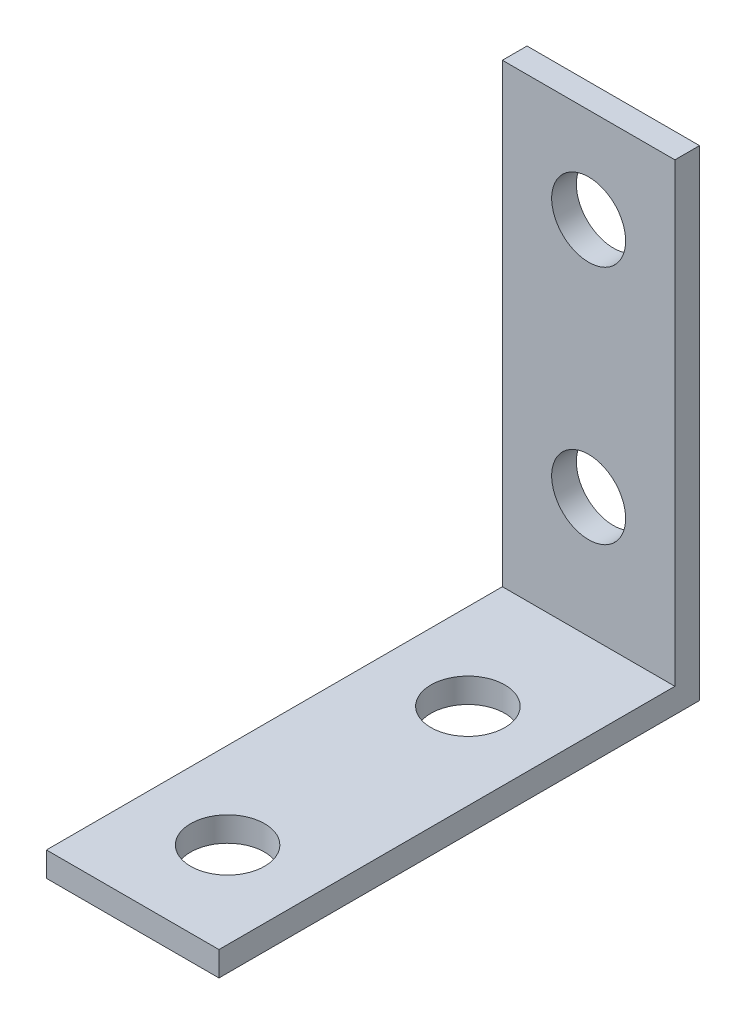
ISO-10303-21;
HEADER;
FILE_DESCRIPTION(('STEP AP214'),'2;1');
FILE_NAME('part.step','',(''),(''),'','','');
FILE_SCHEMA(('AUTOMOTIVE_DESIGN { 1 0 10303 214 1 1 1 1 }'));
ENDSEC;
DATA;
#1=APPLICATION_CONTEXT('core data for automotive mechanical design processes');
#2=APPLICATION_PROTOCOL_DEFINITION('international standard','automotive_design',2000,#1);
#3=PRODUCT_CONTEXT('',#1,'mechanical');
#4=PRODUCT('Part','Part','',(#3));
#5=PRODUCT_RELATED_PRODUCT_CATEGORY('part','',(#4));
#6=PRODUCT_DEFINITION_FORMATION('','',#4);
#7=PRODUCT_DEFINITION_CONTEXT('part definition',#1,'design');
#8=PRODUCT_DEFINITION('design','',#6,#7);
#9=PRODUCT_DEFINITION_SHAPE('','',#8);
#10=(LENGTH_UNIT() NAMED_UNIT(*) SI_UNIT(.MILLI.,.METRE.));
#11=(NAMED_UNIT(*) PLANE_ANGLE_UNIT() SI_UNIT($,.RADIAN.));
#12=(NAMED_UNIT(*) SI_UNIT($,.STERADIAN.) SOLID_ANGLE_UNIT());
#13=UNCERTAINTY_MEASURE_WITH_UNIT(LENGTH_MEASURE(1.E-05),#10,'distance_accuracy_value','');
#14=(GEOMETRIC_REPRESENTATION_CONTEXT(3) GLOBAL_UNCERTAINTY_ASSIGNED_CONTEXT((#13)) GLOBAL_UNIT_ASSIGNED_CONTEXT((#10,
#11,#12)) REPRESENTATION_CONTEXT('',''));
#15=CARTESIAN_POINT('',(0.,0.,0.));
#16=DIRECTION('',(0.,0.,1.));
#17=DIRECTION('',(1.,0.,0.));
#18=AXIS2_PLACEMENT_3D('',#15,#16,#17);
#19=CARTESIAN_POINT('',(14.,0.,21.4942610475525));
#20=DIRECTION('',(0.,0.,-1.));
#21=DIRECTION('',(-1.,0.,0.));
#22=AXIS2_PLACEMENT_3D('',#19,#20,#21);
#23=PLANE('',#22);
#24=DIRECTION('',(0.,-1.,0.));
#25=VECTOR('',#24,1.);
#26=CARTESIAN_POINT('',(0.,0.,21.4942610475525));
#27=LINE('',#26,#25);
#28=CARTESIAN_POINT('',(0.,2.,21.4942610475525));
#29=VERTEX_POINT('',#28);
#30=CARTESIAN_POINT('',(0.,0.,21.4942610475525));
#31=VERTEX_POINT('',#30);
#32=EDGE_CURVE('E116',#29,#31,#27,.T.);
#33=ORIENTED_EDGE('',*,*,#32,.T.);
#34=DIRECTION('',(-1.,0.,0.));
#35=VECTOR('',#34,1.);
#36=CARTESIAN_POINT('',(14.,0.,21.4942610475525));
#37=LINE('',#36,#35);
#38=CARTESIAN_POINT('',(14.,0.,21.4942610475525));
#39=VERTEX_POINT('',#38);
#40=EDGE_CURVE('E11',#39,#31,#37,.T.);
#41=ORIENTED_EDGE('',*,*,#40,.F.);
#42=DIRECTION('',(0.,-1.,0.));
#43=VECTOR('',#42,1.);
#44=CARTESIAN_POINT('',(14.,0.,21.4942610475525));
#45=LINE('',#44,#43);
#46=CARTESIAN_POINT('',(14.,2.,21.4942610475525));
#47=VERTEX_POINT('',#46);
#48=EDGE_CURVE('E127',#47,#39,#45,.T.);
#49=ORIENTED_EDGE('',*,*,#48,.F.);
#50=DIRECTION('',(-1.,0.,0.));
#51=VECTOR('',#50,1.);
#52=CARTESIAN_POINT('',(14.,2.,21.4942610475525));
#53=LINE('',#52,#51);
#54=EDGE_CURVE('E112',#47,#29,#53,.T.);
#55=ORIENTED_EDGE('',*,*,#54,.T.);
#56=EDGE_LOOP('',(#33,#41,#49,#55));
#57=FACE_BOUND('',#56,.T.);
#58=ADVANCED_FACE('F32',(#57),#23,.F.);
#59=CARTESIAN_POINT('',(14.,0.,-17.5057389524475));
#60=DIRECTION('',(0.,1.,0.));
#61=DIRECTION('',(0.,0.,1.));
#62=AXIS2_PLACEMENT_3D('',#59,#60,#61);
#63=PLANE('',#62);
#64=CARTESIAN_POINT('',(7.,0.,-5.70573895244747));
#65=DIRECTION('',(0.,1.,0.));
#66=DIRECTION('',(0.,0.,1.));
#67=AXIS2_PLACEMENT_3D('',#64,#65,#66);
#68=CIRCLE('',#67,3.);
#69=CARTESIAN_POINT('',(7.,0.,-2.70573895244747));
#70=VERTEX_POINT('',#69);
#71=EDGE_CURVE('E260',#70,#70,#68,.T.);
#72=ORIENTED_EDGE('',*,*,#71,.T.);
#73=EDGE_LOOP('',(#72));
#74=FACE_BOUND('',#73,.T.);
#75=CARTESIAN_POINT('',(7.,0.,13.7942610475525));
#76=DIRECTION('',(0.,1.,0.));
#77=DIRECTION('',(0.,0.,1.));
#78=AXIS2_PLACEMENT_3D('',#75,#76,#77);
#79=CIRCLE('',#78,3.);
#80=CARTESIAN_POINT('',(7.,0.,16.7942610475525));
#81=VERTEX_POINT('',#80);
#82=EDGE_CURVE('E120',#81,#81,#79,.T.);
#83=ORIENTED_EDGE('',*,*,#82,.T.);
#84=EDGE_LOOP('',(#83));
#85=FACE_BOUND('',#84,.T.);
#86=DIRECTION('',(0.,0.,-1.));
#87=VECTOR('',#86,1.);
#88=CARTESIAN_POINT('',(0.,0.,-17.5057389524475));
#89=LINE('',#88,#87);
#90=CARTESIAN_POINT('',(0.,0.,-17.5057389524475));
#91=VERTEX_POINT('',#90);
#92=EDGE_CURVE('E119',#31,#91,#89,.T.);
#93=ORIENTED_EDGE('',*,*,#92,.T.);
#94=DIRECTION('',(-1.,0.,0.));
#95=VECTOR('',#94,1.);
#96=CARTESIAN_POINT('',(14.,0.,-17.5057389524475));
#97=LINE('',#96,#95);
#98=CARTESIAN_POINT('',(14.,0.,-17.5057389524475));
#99=VERTEX_POINT('',#98);
#100=EDGE_CURVE('E40',#99,#91,#97,.T.);
#101=ORIENTED_EDGE('',*,*,#100,.F.);
#102=DIRECTION('',(0.,0.,-1.));
#103=VECTOR('',#102,1.);
#104=CARTESIAN_POINT('',(14.,0.,-17.5057389524475));
#105=LINE('',#104,#103);
#106=EDGE_CURVE('E85',#39,#99,#105,.T.);
#107=ORIENTED_EDGE('',*,*,#106,.F.);
#108=ORIENTED_EDGE('',*,*,#40,.T.);
#109=EDGE_LOOP('',(#93,#101,#107,#108));
#110=FACE_BOUND('',#109,.T.);
#111=ADVANCED_FACE('F155',(#74,#85,#110),#63,.F.);
#112=CARTESIAN_POINT('',(14.,39.,-17.5057389524475));
#113=DIRECTION('',(0.,0.,1.));
#114=DIRECTION('',(0.,-1.,0.));
#115=AXIS2_PLACEMENT_3D('',#112,#113,#114);
#116=PLANE('',#115);
#117=CARTESIAN_POINT('',(7.,31.3,-17.5057389524475));
#118=DIRECTION('',(0.,0.,1.));
#119=DIRECTION('',(1.,0.,0.));
#120=AXIS2_PLACEMENT_3D('',#117,#118,#119);
#121=CIRCLE('',#120,3.);
#122=CARTESIAN_POINT('',(10.,31.3,-17.5057389524475));
#123=VERTEX_POINT('',#122);
#124=EDGE_CURVE('E274',#123,#123,#121,.T.);
#125=ORIENTED_EDGE('',*,*,#124,.T.);
#126=EDGE_LOOP('',(#125));
#127=FACE_BOUND('',#126,.T.);
#128=CARTESIAN_POINT('',(7.,11.8,-17.5057389524475));
#129=DIRECTION('',(0.,0.,1.));
#130=DIRECTION('',(1.,0.,0.));
#131=AXIS2_PLACEMENT_3D('',#128,#129,#130);
#132=CIRCLE('',#131,3.);
#133=CARTESIAN_POINT('',(10.,11.8,-17.5057389524475));
#134=VERTEX_POINT('',#133);
#135=EDGE_CURVE('E269',#134,#134,#132,.T.);
#136=ORIENTED_EDGE('',*,*,#135,.T.);
#137=EDGE_LOOP('',(#136));
#138=FACE_BOUND('',#137,.T.);
#139=DIRECTION('',(0.,1.,0.));
#140=VECTOR('',#139,1.);
#141=CARTESIAN_POINT('',(0.,39.,-17.5057389524475));
#142=LINE('',#141,#140);
#143=CARTESIAN_POINT('',(0.,39.,-17.5057389524475));
#144=VERTEX_POINT('',#143);
#145=EDGE_CURVE('E122',#91,#144,#142,.T.);
#146=ORIENTED_EDGE('',*,*,#145,.T.);
#147=DIRECTION('',(-1.,0.,0.));
#148=VECTOR('',#147,1.);
#149=CARTESIAN_POINT('',(14.,39.,-17.5057389524475));
#150=LINE('',#149,#148);
#151=CARTESIAN_POINT('',(14.,39.,-17.5057389524475));
#152=VERTEX_POINT('',#151);
#153=EDGE_CURVE('E107',#152,#144,#150,.T.);
#154=ORIENTED_EDGE('',*,*,#153,.F.);
#155=DIRECTION('',(0.,1.,0.));
#156=VECTOR('',#155,1.);
#157=CARTESIAN_POINT('',(14.,39.,-17.5057389524475));
#158=LINE('',#157,#156);
#159=EDGE_CURVE('E98',#99,#152,#158,.T.);
#160=ORIENTED_EDGE('',*,*,#159,.F.);
#161=ORIENTED_EDGE('',*,*,#100,.T.);
#162=EDGE_LOOP('',(#146,#154,#160,#161));
#163=FACE_BOUND('',#162,.T.);
#164=ADVANCED_FACE('F133',(#127,#138,#163),#116,.F.);
#165=CARTESIAN_POINT('',(14.,39.,-15.5057389524475));
#166=DIRECTION('',(0.,-1.,0.));
#167=DIRECTION('',(0.,0.,-1.));
#168=AXIS2_PLACEMENT_3D('',#165,#166,#167);
#169=PLANE('',#168);
#170=DIRECTION('',(0.,0.,1.));
#171=VECTOR('',#170,1.);
#172=CARTESIAN_POINT('',(0.,39.,-15.5057389524475));
#173=LINE('',#172,#171);
#174=CARTESIAN_POINT('',(0.,39.,-15.5057389524475));
#175=VERTEX_POINT('',#174);
#176=EDGE_CURVE('E106',#144,#175,#173,.T.);
#177=ORIENTED_EDGE('',*,*,#176,.T.);
#178=DIRECTION('',(-1.,0.,0.));
#179=VECTOR('',#178,1.);
#180=CARTESIAN_POINT('',(14.,39.,-15.5057389524475));
#181=LINE('',#180,#179);
#182=CARTESIAN_POINT('',(14.,39.,-15.5057389524475));
#183=VERTEX_POINT('',#182);
#184=EDGE_CURVE('E103',#183,#175,#181,.T.);
#185=ORIENTED_EDGE('',*,*,#184,.F.);
#186=DIRECTION('',(0.,0.,1.));
#187=VECTOR('',#186,1.);
#188=CARTESIAN_POINT('',(14.,39.,-15.5057389524475));
#189=LINE('',#188,#187);
#190=EDGE_CURVE('E92',#152,#183,#189,.T.);
#191=ORIENTED_EDGE('',*,*,#190,.F.);
#192=ORIENTED_EDGE('',*,*,#153,.T.);
#193=EDGE_LOOP('',(#177,#185,#191,#192));
#194=FACE_BOUND('',#193,.T.);
#195=ADVANCED_FACE('F104',(#194),#169,.F.);
#196=CARTESIAN_POINT('',(14.,2.,-15.5057389524475));
#197=DIRECTION('',(0.,0.,-1.));
#198=DIRECTION('',(-1.,0.,0.));
#199=AXIS2_PLACEMENT_3D('',#196,#197,#198);
#200=PLANE('',#199);
#201=CARTESIAN_POINT('',(7.,31.3,-15.5057389524475));
#202=DIRECTION('',(0.,0.,1.));
#203=DIRECTION('',(1.,0.,0.));
#204=AXIS2_PLACEMENT_3D('',#201,#202,#203);
#205=CIRCLE('',#204,3.);
#206=CARTESIAN_POINT('',(10.,31.3,-15.5057389524475));
#207=VERTEX_POINT('',#206);
#208=EDGE_CURVE('E277',#207,#207,#205,.T.);
#209=ORIENTED_EDGE('',*,*,#208,.F.);
#210=EDGE_LOOP('',(#209));
#211=FACE_BOUND('',#210,.T.);
#212=CARTESIAN_POINT('',(7.,11.8,-15.5057389524475));
#213=DIRECTION('',(0.,0.,1.));
#214=DIRECTION('',(1.,0.,0.));
#215=AXIS2_PLACEMENT_3D('',#212,#213,#214);
#216=CIRCLE('',#215,3.);
#217=CARTESIAN_POINT('',(10.,11.8,-15.5057389524475));
#218=VERTEX_POINT('',#217);
#219=EDGE_CURVE('E271',#218,#218,#216,.T.);
#220=ORIENTED_EDGE('',*,*,#219,.F.);
#221=EDGE_LOOP('',(#220));
#222=FACE_BOUND('',#221,.T.);
#223=DIRECTION('',(0.,-1.,0.));
#224=VECTOR('',#223,1.);
#225=CARTESIAN_POINT('',(0.,2.,-15.5057389524475));
#226=LINE('',#225,#224);
#227=CARTESIAN_POINT('',(0.,2.,-15.5057389524475));
#228=VERTEX_POINT('',#227);
#229=EDGE_CURVE('E71',#175,#228,#226,.T.);
#230=ORIENTED_EDGE('',*,*,#229,.T.);
#231=DIRECTION('',(-1.,0.,0.));
#232=VECTOR('',#231,1.);
#233=CARTESIAN_POINT('',(14.,2.,-15.5057389524475));
#234=LINE('',#233,#232);
#235=CARTESIAN_POINT('',(14.,2.,-15.5057389524475));
#236=VERTEX_POINT('',#235);
#237=EDGE_CURVE('E108',#236,#228,#234,.T.);
#238=ORIENTED_EDGE('',*,*,#237,.F.);
#239=DIRECTION('',(0.,-1.,0.));
#240=VECTOR('',#239,1.);
#241=CARTESIAN_POINT('',(14.,2.,-15.5057389524475));
#242=LINE('',#241,#240);
#243=EDGE_CURVE('E96',#183,#236,#242,.T.);
#244=ORIENTED_EDGE('',*,*,#243,.F.);
#245=ORIENTED_EDGE('',*,*,#184,.T.);
#246=EDGE_LOOP('',(#230,#238,#244,#245));
#247=FACE_BOUND('',#246,.T.);
#248=ADVANCED_FACE('F110',(#211,#222,#247),#200,.F.);
#249=CARTESIAN_POINT('',(14.,2.,21.4942610475525));
#250=DIRECTION('',(0.,-1.,0.));
#251=DIRECTION('',(0.,0.,-1.));
#252=AXIS2_PLACEMENT_3D('',#249,#250,#251);
#253=PLANE('',#252);
#254=CARTESIAN_POINT('',(7.,2.,-5.70573895244747));
#255=DIRECTION('',(0.,1.,0.));
#256=DIRECTION('',(0.,0.,1.));
#257=AXIS2_PLACEMENT_3D('',#254,#255,#256);
#258=CIRCLE('',#257,3.);
#259=CARTESIAN_POINT('',(7.,2.,-2.70573895244747));
#260=VERTEX_POINT('',#259);
#261=EDGE_CURVE('E263',#260,#260,#258,.T.);
#262=ORIENTED_EDGE('',*,*,#261,.F.);
#263=EDGE_LOOP('',(#262));
#264=FACE_BOUND('',#263,.T.);
#265=CARTESIAN_POINT('',(7.,2.,13.7942610475525));
#266=DIRECTION('',(0.,1.,0.));
#267=DIRECTION('',(0.,0.,1.));
#268=AXIS2_PLACEMENT_3D('',#265,#266,#267);
#269=CIRCLE('',#268,3.);
#270=CARTESIAN_POINT('',(7.,2.,16.7942610475525));
#271=VERTEX_POINT('',#270);
#272=EDGE_CURVE('E259',#271,#271,#269,.T.);
#273=ORIENTED_EDGE('',*,*,#272,.F.);
#274=EDGE_LOOP('',(#273));
#275=FACE_BOUND('',#274,.T.);
#276=DIRECTION('',(0.,0.,1.));
#277=VECTOR('',#276,1.);
#278=CARTESIAN_POINT('',(0.,2.,21.4942610475525));
#279=LINE('',#278,#277);
#280=EDGE_CURVE('E77',#228,#29,#279,.T.);
#281=ORIENTED_EDGE('',*,*,#280,.T.);
#282=ORIENTED_EDGE('',*,*,#54,.F.);
#283=DIRECTION('',(0.,0.,1.));
#284=VECTOR('',#283,1.);
#285=CARTESIAN_POINT('',(14.,2.,21.4942610475525));
#286=LINE('',#285,#284);
#287=EDGE_CURVE('E48',#236,#47,#286,.T.);
#288=ORIENTED_EDGE('',*,*,#287,.F.);
#289=ORIENTED_EDGE('',*,*,#237,.T.);
#290=EDGE_LOOP('',(#281,#282,#288,#289));
#291=FACE_BOUND('',#290,.T.);
#292=ADVANCED_FACE('F140',(#264,#275,#291),#253,.F.);
#293=CARTESIAN_POINT('',(14.,0.,0.));
#294=DIRECTION('',(-1.,0.,0.));
#295=DIRECTION('',(0.,0.,1.));
#296=AXIS2_PLACEMENT_3D('',#293,#294,#295);
#297=PLANE('',#296);
#298=ORIENTED_EDGE('',*,*,#48,.T.);
#299=ORIENTED_EDGE('',*,*,#106,.T.);
#300=ORIENTED_EDGE('',*,*,#159,.T.);
#301=ORIENTED_EDGE('',*,*,#190,.T.);
#302=ORIENTED_EDGE('',*,*,#243,.T.);
#303=ORIENTED_EDGE('',*,*,#287,.T.);
#304=EDGE_LOOP('',(#298,#299,#300,#301,#302,#303));
#305=FACE_BOUND('',#304,.T.);
#306=ADVANCED_FACE('F94',(#305),#297,.F.);
#307=CARTESIAN_POINT('',(0.,0.,0.));
#308=DIRECTION('',(-1.,0.,0.));
#309=DIRECTION('',(0.,0.,1.));
#310=AXIS2_PLACEMENT_3D('',#307,#308,#309);
#311=PLANE('',#310);
#312=ORIENTED_EDGE('',*,*,#32,.F.);
#313=ORIENTED_EDGE('',*,*,#280,.F.);
#314=ORIENTED_EDGE('',*,*,#229,.F.);
#315=ORIENTED_EDGE('',*,*,#176,.F.);
#316=ORIENTED_EDGE('',*,*,#145,.F.);
#317=ORIENTED_EDGE('',*,*,#92,.F.);
#318=EDGE_LOOP('',(#312,#313,#314,#315,#316,#317));
#319=FACE_BOUND('',#318,.T.);
#320=ADVANCED_FACE('F136',(#319),#311,.T.);
#321=CARTESIAN_POINT('',(7.,0.,13.7942610475525));
#322=DIRECTION('',(0.,1.,0.));
#323=DIRECTION('',(0.,0.,1.));
#324=AXIS2_PLACEMENT_3D('',#321,#322,#323);
#325=CYLINDRICAL_SURFACE('',#324,3.);
#326=ORIENTED_EDGE('',*,*,#82,.F.);
#327=EDGE_LOOP('',(#326));
#328=FACE_BOUND('',#327,.T.);
#329=ORIENTED_EDGE('',*,*,#272,.T.);
#330=EDGE_LOOP('',(#329));
#331=FACE_BOUND('',#330,.T.);
#332=ADVANCED_FACE('F213',(#328,#331),#325,.F.);
#333=CARTESIAN_POINT('',(7.,0.,-5.70573895244747));
#334=DIRECTION('',(0.,1.,0.));
#335=DIRECTION('',(0.,0.,1.));
#336=AXIS2_PLACEMENT_3D('',#333,#334,#335);
#337=CYLINDRICAL_SURFACE('',#336,3.);
#338=ORIENTED_EDGE('',*,*,#71,.F.);
#339=EDGE_LOOP('',(#338));
#340=FACE_BOUND('',#339,.T.);
#341=ORIENTED_EDGE('',*,*,#261,.T.);
#342=EDGE_LOOP('',(#341));
#343=FACE_BOUND('',#342,.T.);
#344=ADVANCED_FACE('F193',(#340,#343),#337,.F.);
#345=CARTESIAN_POINT('',(7.,11.8,-17.5057389524475));
#346=DIRECTION('',(0.,0.,1.));
#347=DIRECTION('',(1.,0.,0.));
#348=AXIS2_PLACEMENT_3D('',#345,#346,#347);
#349=CYLINDRICAL_SURFACE('',#348,3.);
#350=ORIENTED_EDGE('',*,*,#135,.F.);
#351=EDGE_LOOP('',(#350));
#352=FACE_BOUND('',#351,.T.);
#353=ORIENTED_EDGE('',*,*,#219,.T.);
#354=EDGE_LOOP('',(#353));
#355=FACE_BOUND('',#354,.T.);
#356=ADVANCED_FACE('F187',(#352,#355),#349,.F.);
#357=CARTESIAN_POINT('',(7.,31.3,-17.5057389524475));
#358=DIRECTION('',(0.,0.,1.));
#359=DIRECTION('',(1.,0.,0.));
#360=AXIS2_PLACEMENT_3D('',#357,#358,#359);
#361=CYLINDRICAL_SURFACE('',#360,3.);
#362=ORIENTED_EDGE('',*,*,#124,.F.);
#363=EDGE_LOOP('',(#362));
#364=FACE_BOUND('',#363,.T.);
#365=ORIENTED_EDGE('',*,*,#208,.T.);
#366=EDGE_LOOP('',(#365));
#367=FACE_BOUND('',#366,.T.);
#368=ADVANCED_FACE('F192',(#364,#367),#361,.F.);
#369=CLOSED_SHELL('',(#58,#111,#164,#195,#248,#292,#306,#320,#332,#344,#356,#368));
#370=MANIFOLD_SOLID_BREP('B2',#369);
#371=ADVANCED_BREP_SHAPE_REPRESENTATION('',(#18,#370),#14);
#372=SHAPE_DEFINITION_REPRESENTATION(#9,#371);
ENDSEC;
END-ISO-10303-21;
